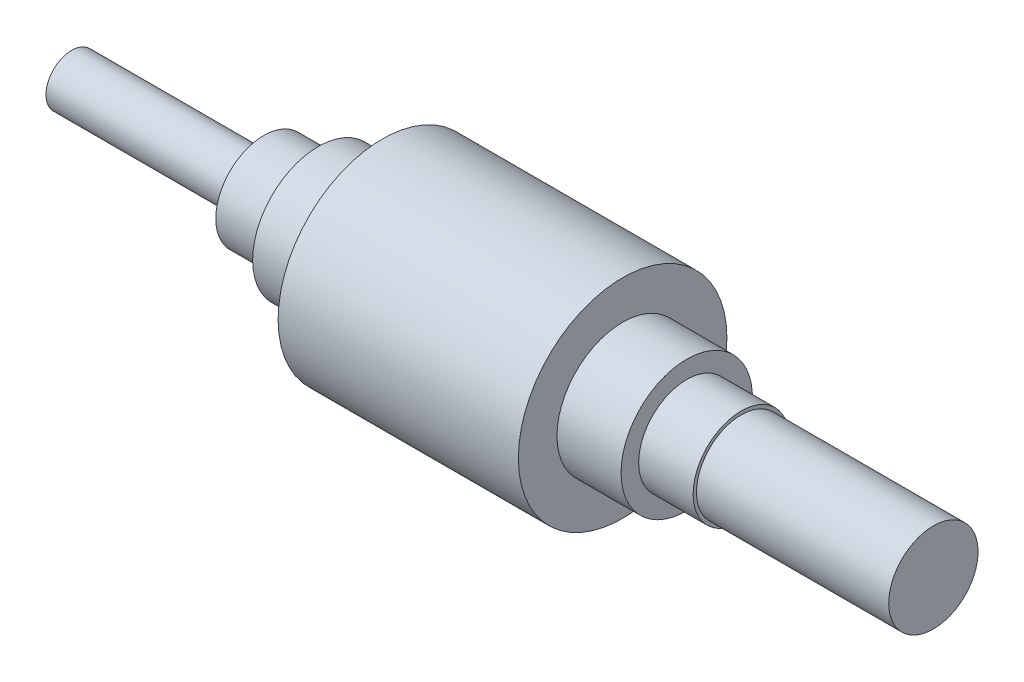
ISO-10303-21;
HEADER;
FILE_DESCRIPTION(('STEP AP214'),'2;1');
FILE_NAME('part.step','',(''),(''),'','','');
FILE_SCHEMA(('AUTOMOTIVE_DESIGN { 1 0 10303 214 1 1 1 1 }'));
ENDSEC;
DATA;
#1=APPLICATION_CONTEXT('core data for automotive mechanical design processes');
#2=APPLICATION_PROTOCOL_DEFINITION('international standard','automotive_design',2000,#1);
#3=PRODUCT_CONTEXT('',#1,'mechanical');
#4=PRODUCT('Part','Part','',(#3));
#5=PRODUCT_RELATED_PRODUCT_CATEGORY('part','',(#4));
#6=PRODUCT_DEFINITION_FORMATION('','',#4);
#7=PRODUCT_DEFINITION_CONTEXT('part definition',#1,'design');
#8=PRODUCT_DEFINITION('design','',#6,#7);
#9=PRODUCT_DEFINITION_SHAPE('','',#8);
#10=(LENGTH_UNIT() NAMED_UNIT(*) SI_UNIT(.MILLI.,.METRE.));
#11=(NAMED_UNIT(*) PLANE_ANGLE_UNIT() SI_UNIT($,.RADIAN.));
#12=(NAMED_UNIT(*) SI_UNIT($,.STERADIAN.) SOLID_ANGLE_UNIT());
#13=UNCERTAINTY_MEASURE_WITH_UNIT(LENGTH_MEASURE(1.E-05),#10,'distance_accuracy_value','');
#14=(GEOMETRIC_REPRESENTATION_CONTEXT(3) GLOBAL_UNCERTAINTY_ASSIGNED_CONTEXT((#13)) GLOBAL_UNIT_ASSIGNED_CONTEXT((#10,
#11,#12)) REPRESENTATION_CONTEXT('',''));
#15=CARTESIAN_POINT('',(0.,0.,0.));
#16=DIRECTION('',(0.,0.,1.));
#17=DIRECTION('',(1.,0.,0.));
#18=AXIS2_PLACEMENT_3D('',#15,#16,#17);
#19=CARTESIAN_POINT('',(0.,4.,0.));
#20=DIRECTION('',(1.,0.,0.));
#21=DIRECTION('',(0.,0.,-1.));
#22=AXIS2_PLACEMENT_3D('',#19,#20,#21);
#23=PLANE('',#22);
#24=CARTESIAN_POINT('',(0.,0.,0.));
#25=DIRECTION('',(-1.,0.,0.));
#26=DIRECTION('',(0.,0.,1.));
#27=AXIS2_PLACEMENT_3D('',#24,#25,#26);
#28=CIRCLE('',#27,4.);
#29=CARTESIAN_POINT('',(0.,0.,4.));
#30=VERTEX_POINT('',#29);
#31=EDGE_CURVE('E102',#30,#30,#28,.T.);
#32=ORIENTED_EDGE('',*,*,#31,.T.);
#33=EDGE_LOOP('',(#32));
#34=FACE_BOUND('',#33,.T.);
#35=ADVANCED_FACE('F41',(#34),#23,.F.);
#36=CARTESIAN_POINT('',(134.5,6.975,0.));
#37=DIRECTION('',(-1.,0.,0.));
#38=DIRECTION('',(0.,0.,1.));
#39=AXIS2_PLACEMENT_3D('',#36,#37,#38);
#40=PLANE('',#39);
#41=CARTESIAN_POINT('',(134.5,0.,0.));
#42=DIRECTION('',(-1.,0.,0.));
#43=DIRECTION('',(0.,0.,1.));
#44=AXIS2_PLACEMENT_3D('',#41,#42,#43);
#45=CIRCLE('',#44,6.975);
#46=CARTESIAN_POINT('',(134.5,0.,6.975));
#47=VERTEX_POINT('',#46);
#48=EDGE_CURVE('E10',#47,#47,#45,.T.);
#49=ORIENTED_EDGE('',*,*,#48,.F.);
#50=EDGE_LOOP('',(#49));
#51=FACE_BOUND('',#50,.T.);
#52=ADVANCED_FACE('F182',(#51),#40,.F.);
#53=CARTESIAN_POINT('',(0.,0.,0.));
#54=DIRECTION('',(-1.,0.,0.));
#55=DIRECTION('',(0.,0.,1.));
#56=AXIS2_PLACEMENT_3D('',#53,#54,#55);
#57=CYLINDRICAL_SURFACE('',#56,6.975);
#58=CARTESIAN_POINT('',(104.5,0.,0.));
#59=DIRECTION('',(-1.,0.,0.));
#60=DIRECTION('',(0.,0.,1.));
#61=AXIS2_PLACEMENT_3D('',#58,#59,#60);
#62=CIRCLE('',#61,6.975);
#63=CARTESIAN_POINT('',(104.5,0.,6.975));
#64=VERTEX_POINT('',#63);
#65=EDGE_CURVE('E48',#64,#64,#62,.T.);
#66=ORIENTED_EDGE('',*,*,#65,.F.);
#67=EDGE_LOOP('',(#66));
#68=FACE_BOUND('',#67,.T.);
#69=ORIENTED_EDGE('',*,*,#48,.T.);
#70=EDGE_LOOP('',(#69));
#71=FACE_BOUND('',#70,.T.);
#72=ADVANCED_FACE('F177',(#68,#71),#57,.T.);
#73=CARTESIAN_POINT('',(104.5,7.5,0.));
#74=DIRECTION('',(-1.,0.,0.));
#75=DIRECTION('',(0.,0.,1.));
#76=AXIS2_PLACEMENT_3D('',#73,#74,#75);
#77=PLANE('',#76);
#78=CARTESIAN_POINT('',(104.5,0.,0.));
#79=DIRECTION('',(-1.,0.,0.));
#80=DIRECTION('',(0.,0.,1.));
#81=AXIS2_PLACEMENT_3D('',#78,#79,#80);
#82=CIRCLE('',#81,7.5);
#83=CARTESIAN_POINT('',(104.5,0.,7.5));
#84=VERTEX_POINT('',#83);
#85=EDGE_CURVE('E55',#84,#84,#82,.T.);
#86=ORIENTED_EDGE('',*,*,#85,.F.);
#87=EDGE_LOOP('',(#86));
#88=FACE_BOUND('',#87,.T.);
#89=ORIENTED_EDGE('',*,*,#65,.T.);
#90=EDGE_LOOP('',(#89));
#91=FACE_BOUND('',#90,.T.);
#92=ADVANCED_FACE('F172',(#88,#91),#77,.F.);
#93=CARTESIAN_POINT('',(0.,0.,0.));
#94=DIRECTION('',(-1.,0.,0.));
#95=DIRECTION('',(0.,0.,1.));
#96=AXIS2_PLACEMENT_3D('',#93,#94,#95);
#97=CYLINDRICAL_SURFACE('',#96,7.50000000000001);
#98=CARTESIAN_POINT('',(96.,0.,0.));
#99=DIRECTION('',(-1.,0.,0.));
#100=DIRECTION('',(0.,0.,1.));
#101=AXIS2_PLACEMENT_3D('',#98,#99,#100);
#102=CIRCLE('',#101,7.50000000000001);
#103=CARTESIAN_POINT('',(96.,0.,7.50000000000001));
#104=VERTEX_POINT('',#103);
#105=EDGE_CURVE('E61',#104,#104,#102,.T.);
#106=ORIENTED_EDGE('',*,*,#105,.F.);
#107=EDGE_LOOP('',(#106));
#108=FACE_BOUND('',#107,.T.);
#109=ORIENTED_EDGE('',*,*,#85,.T.);
#110=EDGE_LOOP('',(#109));
#111=FACE_BOUND('',#110,.T.);
#112=ADVANCED_FACE('F166',(#108,#111),#97,.T.);
#113=CARTESIAN_POINT('',(96.,10.25,0.));
#114=DIRECTION('',(-1.,0.,0.));
#115=DIRECTION('',(0.,0.,1.));
#116=AXIS2_PLACEMENT_3D('',#113,#114,#115);
#117=PLANE('',#116);
#118=CARTESIAN_POINT('',(96.,0.,0.));
#119=DIRECTION('',(-1.,0.,0.));
#120=DIRECTION('',(0.,0.,1.));
#121=AXIS2_PLACEMENT_3D('',#118,#119,#120);
#122=CIRCLE('',#121,10.25);
#123=CARTESIAN_POINT('',(96.,0.,10.25));
#124=VERTEX_POINT('',#123);
#125=EDGE_CURVE('E67',#124,#124,#122,.T.);
#126=ORIENTED_EDGE('',*,*,#125,.F.);
#127=EDGE_LOOP('',(#126));
#128=FACE_BOUND('',#127,.T.);
#129=ORIENTED_EDGE('',*,*,#105,.T.);
#130=EDGE_LOOP('',(#129));
#131=FACE_BOUND('',#130,.T.);
#132=ADVANCED_FACE('F160',(#128,#131),#117,.F.);
#133=CARTESIAN_POINT('',(0.,0.,0.));
#134=DIRECTION('',(-1.,0.,0.));
#135=DIRECTION('',(0.,0.,1.));
#136=AXIS2_PLACEMENT_3D('',#133,#134,#135);
#137=CYLINDRICAL_SURFACE('',#136,10.25);
#138=CARTESIAN_POINT('',(86.,0.,0.));
#139=DIRECTION('',(-1.,0.,0.));
#140=DIRECTION('',(0.,0.,1.));
#141=AXIS2_PLACEMENT_3D('',#138,#139,#140);
#142=CIRCLE('',#141,10.25);
#143=CARTESIAN_POINT('',(86.,0.,10.25));
#144=VERTEX_POINT('',#143);
#145=EDGE_CURVE('E71',#144,#144,#142,.T.);
#146=ORIENTED_EDGE('',*,*,#145,.F.);
#147=EDGE_LOOP('',(#146));
#148=FACE_BOUND('',#147,.T.);
#149=ORIENTED_EDGE('',*,*,#125,.T.);
#150=EDGE_LOOP('',(#149));
#151=FACE_BOUND('',#150,.T.);
#152=ADVANCED_FACE('F154',(#148,#151),#137,.T.);
#153=CARTESIAN_POINT('',(86.,16.275,0.));
#154=DIRECTION('',(-1.,0.,0.));
#155=DIRECTION('',(0.,0.,1.));
#156=AXIS2_PLACEMENT_3D('',#153,#154,#155);
#157=PLANE('',#156);
#158=CARTESIAN_POINT('',(86.,0.,0.));
#159=DIRECTION('',(-1.,0.,0.));
#160=DIRECTION('',(0.,0.,1.));
#161=AXIS2_PLACEMENT_3D('',#158,#159,#160);
#162=CIRCLE('',#161,16.275);
#163=CARTESIAN_POINT('',(86.,0.,16.275));
#164=VERTEX_POINT('',#163);
#165=EDGE_CURVE('E75',#164,#164,#162,.T.);
#166=ORIENTED_EDGE('',*,*,#165,.F.);
#167=EDGE_LOOP('',(#166));
#168=FACE_BOUND('',#167,.T.);
#169=ORIENTED_EDGE('',*,*,#145,.T.);
#170=EDGE_LOOP('',(#169));
#171=FACE_BOUND('',#170,.T.);
#172=ADVANCED_FACE('F148',(#168,#171),#157,.F.);
#173=CARTESIAN_POINT('',(0.,0.,0.));
#174=DIRECTION('',(-1.,0.,0.));
#175=DIRECTION('',(0.,0.,1.));
#176=AXIS2_PLACEMENT_3D('',#173,#174,#175);
#177=CYLINDRICAL_SURFACE('',#176,16.275);
#178=CARTESIAN_POINT('',(48.5,0.,0.));
#179=DIRECTION('',(-1.,0.,0.));
#180=DIRECTION('',(0.,0.,1.));
#181=AXIS2_PLACEMENT_3D('',#178,#179,#180);
#182=CIRCLE('',#181,16.275);
#183=CARTESIAN_POINT('',(48.5,0.,16.275));
#184=VERTEX_POINT('',#183);
#185=EDGE_CURVE('E79',#184,#184,#182,.T.);
#186=ORIENTED_EDGE('',*,*,#185,.F.);
#187=EDGE_LOOP('',(#186));
#188=FACE_BOUND('',#187,.T.);
#189=ORIENTED_EDGE('',*,*,#165,.T.);
#190=EDGE_LOOP('',(#189));
#191=FACE_BOUND('',#190,.T.);
#192=ADVANCED_FACE('F142',(#188,#191),#177,.T.);
#193=CARTESIAN_POINT('',(48.5,10.25,0.));
#194=DIRECTION('',(1.,0.,0.));
#195=DIRECTION('',(0.,0.,-1.));
#196=AXIS2_PLACEMENT_3D('',#193,#194,#195);
#197=PLANE('',#196);
#198=CARTESIAN_POINT('',(48.5,0.,0.));
#199=DIRECTION('',(-1.,0.,0.));
#200=DIRECTION('',(0.,0.,1.));
#201=AXIS2_PLACEMENT_3D('',#198,#199,#200);
#202=CIRCLE('',#201,10.25);
#203=CARTESIAN_POINT('',(48.5,0.,10.25));
#204=VERTEX_POINT('',#203);
#205=EDGE_CURVE('E83',#204,#204,#202,.T.);
#206=ORIENTED_EDGE('',*,*,#205,.F.);
#207=EDGE_LOOP('',(#206));
#208=FACE_BOUND('',#207,.T.);
#209=ORIENTED_EDGE('',*,*,#185,.T.);
#210=EDGE_LOOP('',(#209));
#211=FACE_BOUND('',#210,.T.);
#212=ADVANCED_FACE('F136',(#208,#211),#197,.F.);
#213=CARTESIAN_POINT('',(0.,0.,0.));
#214=DIRECTION('',(-1.,0.,0.));
#215=DIRECTION('',(0.,0.,1.));
#216=AXIS2_PLACEMENT_3D('',#213,#214,#215);
#217=CYLINDRICAL_SURFACE('',#216,10.25);
#218=CARTESIAN_POINT('',(38.5,0.,0.));
#219=DIRECTION('',(-1.,0.,0.));
#220=DIRECTION('',(0.,0.,1.));
#221=AXIS2_PLACEMENT_3D('',#218,#219,#220);
#222=CIRCLE('',#221,10.25);
#223=CARTESIAN_POINT('',(38.5,0.,10.25));
#224=VERTEX_POINT('',#223);
#225=EDGE_CURVE('E87',#224,#224,#222,.T.);
#226=ORIENTED_EDGE('',*,*,#225,.F.);
#227=EDGE_LOOP('',(#226));
#228=FACE_BOUND('',#227,.T.);
#229=ORIENTED_EDGE('',*,*,#205,.T.);
#230=EDGE_LOOP('',(#229));
#231=FACE_BOUND('',#230,.T.);
#232=ADVANCED_FACE('F130',(#228,#231),#217,.T.);
#233=CARTESIAN_POINT('',(38.5,7.50000000000001,0.));
#234=DIRECTION('',(1.,0.,0.));
#235=DIRECTION('',(0.,0.,-1.));
#236=AXIS2_PLACEMENT_3D('',#233,#234,#235);
#237=PLANE('',#236);
#238=CARTESIAN_POINT('',(38.5,0.,0.));
#239=DIRECTION('',(-1.,0.,0.));
#240=DIRECTION('',(0.,0.,1.));
#241=AXIS2_PLACEMENT_3D('',#238,#239,#240);
#242=CIRCLE('',#241,7.50000000000001);
#243=CARTESIAN_POINT('',(38.5,0.,7.50000000000001));
#244=VERTEX_POINT('',#243);
#245=EDGE_CURVE('E91',#244,#244,#242,.T.);
#246=ORIENTED_EDGE('',*,*,#245,.F.);
#247=EDGE_LOOP('',(#246));
#248=FACE_BOUND('',#247,.T.);
#249=ORIENTED_EDGE('',*,*,#225,.T.);
#250=EDGE_LOOP('',(#249));
#251=FACE_BOUND('',#250,.T.);
#252=ADVANCED_FACE('F124',(#248,#251),#237,.F.);
#253=CARTESIAN_POINT('',(0.,0.,0.));
#254=DIRECTION('',(-1.,0.,0.));
#255=DIRECTION('',(0.,0.,1.));
#256=AXIS2_PLACEMENT_3D('',#253,#254,#255);
#257=CYLINDRICAL_SURFACE('',#256,7.50000000000001);
#258=CARTESIAN_POINT('',(30.,0.,0.));
#259=DIRECTION('',(-1.,0.,0.));
#260=DIRECTION('',(0.,0.,1.));
#261=AXIS2_PLACEMENT_3D('',#258,#259,#260);
#262=CIRCLE('',#261,7.50000000000001);
#263=CARTESIAN_POINT('',(30.,0.,7.50000000000001));
#264=VERTEX_POINT('',#263);
#265=EDGE_CURVE('E95',#264,#264,#262,.T.);
#266=ORIENTED_EDGE('',*,*,#265,.F.);
#267=EDGE_LOOP('',(#266));
#268=FACE_BOUND('',#267,.T.);
#269=ORIENTED_EDGE('',*,*,#245,.T.);
#270=EDGE_LOOP('',(#269));
#271=FACE_BOUND('',#270,.T.);
#272=ADVANCED_FACE('F118',(#268,#271),#257,.T.);
#273=CARTESIAN_POINT('',(30.,7.50000000000001,0.));
#274=DIRECTION('',(1.,0.,0.));
#275=DIRECTION('',(0.,0.,-1.));
#276=AXIS2_PLACEMENT_3D('',#273,#274,#275);
#277=PLANE('',#276);
#278=CARTESIAN_POINT('',(30.,0.,0.));
#279=DIRECTION('',(-1.,0.,0.));
#280=DIRECTION('',(0.,0.,1.));
#281=AXIS2_PLACEMENT_3D('',#278,#279,#280);
#282=CIRCLE('',#281,4.);
#283=CARTESIAN_POINT('',(30.,0.,4.));
#284=VERTEX_POINT('',#283);
#285=EDGE_CURVE('E99',#284,#284,#282,.T.);
#286=ORIENTED_EDGE('',*,*,#285,.F.);
#287=EDGE_LOOP('',(#286));
#288=FACE_BOUND('',#287,.T.);
#289=ORIENTED_EDGE('',*,*,#265,.T.);
#290=EDGE_LOOP('',(#289));
#291=FACE_BOUND('',#290,.T.);
#292=ADVANCED_FACE('F112',(#288,#291),#277,.F.);
#293=CARTESIAN_POINT('',(0.,0.,0.));
#294=DIRECTION('',(-1.,0.,0.));
#295=DIRECTION('',(0.,0.,1.));
#296=AXIS2_PLACEMENT_3D('',#293,#294,#295);
#297=CYLINDRICAL_SURFACE('',#296,4.);
#298=ORIENTED_EDGE('',*,*,#31,.F.);
#299=EDGE_LOOP('',(#298));
#300=FACE_BOUND('',#299,.T.);
#301=ORIENTED_EDGE('',*,*,#285,.T.);
#302=EDGE_LOOP('',(#301));
#303=FACE_BOUND('',#302,.T.);
#304=ADVANCED_FACE('F109',(#300,#303),#297,.T.);
#305=CLOSED_SHELL('',(#35,#52,#72,#92,#112,#132,#152,#172,#192,#212,#232,#252,#272,#292,#304));
#306=MANIFOLD_SOLID_BREP('B2',#305);
#307=ADVANCED_BREP_SHAPE_REPRESENTATION('',(#18,#306),#14);
#308=SHAPE_DEFINITION_REPRESENTATION(#9,#307);
ENDSEC;
END-ISO-10303-21;
